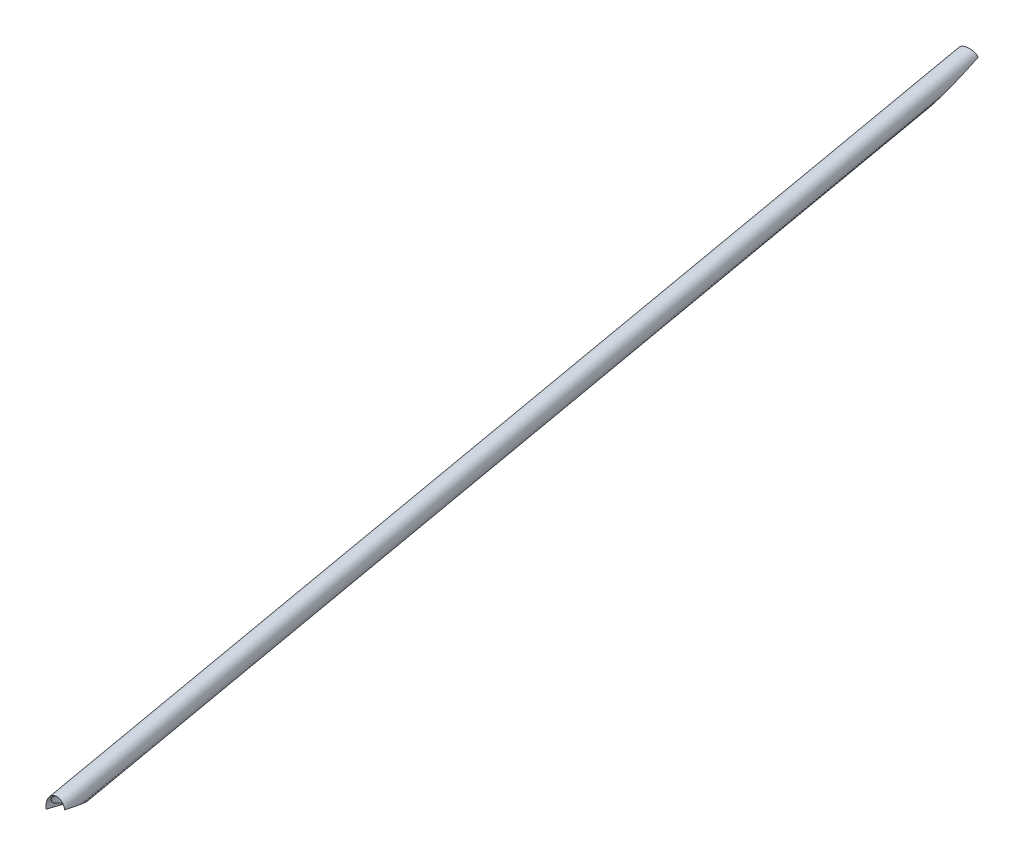
ISO-10303-21;
HEADER;
FILE_DESCRIPTION(('STEP AP214'),'2;1');
FILE_NAME('part.step','',(''),(''),'','','');
FILE_SCHEMA(('AUTOMOTIVE_DESIGN { 1 0 10303 214 1 1 1 1 }'));
ENDSEC;
DATA;
#1=APPLICATION_CONTEXT('core data for automotive mechanical design processes');
#2=APPLICATION_PROTOCOL_DEFINITION('international standard','automotive_design',2000,#1);
#3=PRODUCT_CONTEXT('',#1,'mechanical');
#4=PRODUCT('Part','Part','',(#3));
#5=PRODUCT_RELATED_PRODUCT_CATEGORY('part','',(#4));
#6=PRODUCT_DEFINITION_FORMATION('','',#4);
#7=PRODUCT_DEFINITION_CONTEXT('part definition',#1,'design');
#8=PRODUCT_DEFINITION('design','',#6,#7);
#9=PRODUCT_DEFINITION_SHAPE('','',#8);
#10=(LENGTH_UNIT() NAMED_UNIT(*) SI_UNIT(.MILLI.,.METRE.));
#11=(NAMED_UNIT(*) PLANE_ANGLE_UNIT() SI_UNIT($,.RADIAN.));
#12=(NAMED_UNIT(*) SI_UNIT($,.STERADIAN.) SOLID_ANGLE_UNIT());
#13=UNCERTAINTY_MEASURE_WITH_UNIT(LENGTH_MEASURE(1.E-05),#10,'distance_accuracy_value','');
#14=(GEOMETRIC_REPRESENTATION_CONTEXT(3) GLOBAL_UNCERTAINTY_ASSIGNED_CONTEXT((#13)) GLOBAL_UNIT_ASSIGNED_CONTEXT((#10,
#11,#12)) REPRESENTATION_CONTEXT('',''));
#15=CARTESIAN_POINT('',(0.,0.,0.));
#16=DIRECTION('',(0.,0.,1.));
#17=DIRECTION('',(1.,0.,0.));
#18=AXIS2_PLACEMENT_3D('',#15,#16,#17);
#19=CARTESIAN_POINT('',(-325.,320.,-1580.));
#20=DIRECTION('',(0.0427126536783039,-0.062929792122569,-0.997103540500769));
#21=DIRECTION('',(0.,0.998014330188054,-0.0629872744234135));
#22=AXIS2_PLACEMENT_3D('',#19,#20,#21);
#23=PLANE('',#22);
#24=CARTESIAN_POINT('',(-325.,320.,-1580.));
#25=DIRECTION('',(0.0427126536783039,-0.062929792122569,-0.997103540500769));
#26=DIRECTION('',(-0.611440895819702,0.787641342485715,-0.0759022168747456));
#27=AXIS2_PLACEMENT_3D('',#24,#25,#26);
#28=ELLIPSE('',#27,11.2549576190536,11.);
#29=CARTESIAN_POINT('',(-315.659557692795,325.814860529695,-1579.96687694731));
#30=VERTEX_POINT('',#29);
#31=CARTESIAN_POINT('',(-314.891903689022,324.374891386604,-1579.84311297152));
#32=VERTEX_POINT('',#31);
#33=EDGE_CURVE('E116',#30,#32,#28,.T.);
#34=ORIENTED_EDGE('',*,*,#33,.T.);
#35=CARTESIAN_POINT('',(-325.,320.,-1580.));
#36=DIRECTION('',(0.0427126536783039,-0.062929792122569,-0.997103540500769));
#37=DIRECTION('',(0.489400664257567,-0.868759037548238,0.07579396085779));
#38=AXIS2_PLACEMENT_3D('',#35,#36,#37);
#39=ELLIPSE('',#38,12.7182524712078,11.);
#40=EDGE_CURVE('E121',#32,#30,#39,.F.);
#41=ORIENTED_EDGE('',*,*,#40,.T.);
#42=EDGE_LOOP('',(#34,#41));
#43=FACE_BOUND('',#42,.T.);
#44=ADVANCED_FACE('F41',(#43),#23,.T.);
#45=CARTESIAN_POINT('',(-225.,200.,-450.));
#46=DIRECTION('',(-0.0876619818920292,0.105194378270435,-0.99058039537993));
#47=DIRECTION('',(0.,0.994408591727349,0.105600912395825));
#48=AXIS2_PLACEMENT_3D('',#45,#46,#47);
#49=CYLINDRICAL_SURFACE('',#48,9.39999999999998);
#50=CARTESIAN_POINT('',(-324.393535402177,328.61968324485,-1572.15430146808));
#51=CARTESIAN_POINT('',(-324.166744376046,328.618152850045,-1572.13983609363));
#52=CARTESIAN_POINT('',(-323.940255561203,328.608186920859,-1572.12234851625));
#53=CARTESIAN_POINT('',(-323.489240649024,328.571639886614,-1572.08011292913));
#54=CARTESIAN_POINT('',(-323.264714756988,328.545057064204,-1572.0553641691));
#55=CARTESIAN_POINT('',(-322.819229238548,328.475722569363,-1571.99725162309));
#56=CARTESIAN_POINT('',(-322.598270695505,328.432966078034,-1571.96388527047));
#57=CARTESIAN_POINT('',(-322.16168061802,328.332043520105,-1571.88707140375));
#58=CARTESIAN_POINT('',(-321.946048892917,328.273878005912,-1571.84362425103));
#59=CARTESIAN_POINT('',(-321.521015898234,328.142984336842,-1571.74496227385));
#60=CARTESIAN_POINT('',(-321.311642807215,328.070199204964,-1571.68970135164));
#61=CARTESIAN_POINT('',(-320.901801533403,327.911743430264,-1571.56613146979));
#62=CARTESIAN_POINT('',(-320.701333190628,327.826073019059,-1571.49782274467));
#63=CARTESIAN_POINT('',(-320.311124293689,327.643870848528,-1571.34714859539));
#64=CARTESIAN_POINT('',(-320.121374420538,327.547348749386,-1571.26479564018));
#65=CARTESIAN_POINT('',(-319.753791772083,327.345662483027,-1571.08541295637));
#66=CARTESIAN_POINT('',(-319.575958450105,327.240498712743,-1570.98838390171));
#67=CARTESIAN_POINT('',(-319.243248327993,327.030366503856,-1570.78584562536));
#68=CARTESIAN_POINT('',(-319.087636252788,326.925751865243,-1570.68117326675));
#69=CARTESIAN_POINT('',(-318.788121665251,326.713046030105,-1570.45940671664));
#70=CARTESIAN_POINT('',(-318.644218601434,326.60495499765,-1570.34231311077));
#71=CARTESIAN_POINT('',(-318.367980034763,326.387071272029,-1570.09660203092));
#72=CARTESIAN_POINT('',(-318.235646852239,326.277278242703,-1569.96798225579));
#73=CARTESIAN_POINT('',(-317.982081819845,326.057483034995,-1569.70042122225));
#74=CARTESIAN_POINT('',(-317.860851385594,325.947480831764,-1569.56147865175));
#75=CARTESIAN_POINT('',(-317.550290410968,325.654382721319,-1569.17757493963));
#76=CARTESIAN_POINT('',(-317.370289008123,325.472116533096,-1568.92440912344));
#77=CARTESIAN_POINT('',(-317.034843784465,325.113382847678,-1568.39841452761));
#78=CARTESIAN_POINT('',(-316.879419114084,324.936919956438,-1568.12557065331));
#79=CARTESIAN_POINT('',(-316.661138915736,324.677180116869,-1567.7047325348));
#80=CARTESIAN_POINT('',(-316.590717847967,324.591244087139,-1567.56220110694));
#81=CARTESIAN_POINT('',(-316.454455598542,324.421166899664,-1567.2739063346));
#82=CARTESIAN_POINT('',(-316.388614454549,324.337025756683,-1567.12814296354));
#83=CARTESIAN_POINT('',(-316.261071310276,324.170569676423,-1566.83389243609));
#84=CARTESIAN_POINT('',(-316.199367583027,324.08825398692,-1566.6854064495));
#85=CARTESIAN_POINT('',(-316.079650130724,323.925364032842,-1566.38602088556));
#86=CARTESIAN_POINT('',(-316.02163635837,323.844789745952,-1566.23512133919));
#87=CARTESIAN_POINT('',(-315.863164184722,323.620583534103,-1565.80788270126));
#88=CARTESIAN_POINT('',(-315.766475118774,323.478853164775,-1565.52914291904));
#89=CARTESIAN_POINT('',(-315.582048085814,323.200344672482,-1564.96625629786));
#90=CARTESIAN_POINT('',(-315.494311731047,323.063567444352,-1564.68210849589));
#91=CARTESIAN_POINT('',(-315.326270276812,322.7943489937,-1564.10938257906));
#92=CARTESIAN_POINT('',(-315.245969710218,322.661910447423,-1563.82080188525));
#93=CARTESIAN_POINT('',(-315.091678164876,322.400915662425,-1563.24020694536));
#94=CARTESIAN_POINT('',(-315.017687622553,322.272359692635,-1562.94819246337));
#95=CARTESIAN_POINT('',(-314.874901513614,322.018314645094,-1562.36062007707));
#96=CARTESIAN_POINT('',(-314.806120141292,321.892834535699,-1562.0650548663));
#97=CARTESIAN_POINT('',(-314.673226940423,321.644852617209,-1561.47162976307));
#98=CARTESIAN_POINT('',(-314.609115268626,321.522350908182,-1561.17376979396));
#99=CARTESIAN_POINT('',(-314.422907735964,321.158808793711,-1560.27758044834));
#100=CARTESIAN_POINT('',(-314.306886049678,320.921635424291,-1559.67641756892));
#101=CARTESIAN_POINT('',(-314.086865663091,320.453549453743,-1558.46487790617));
#102=CARTESIAN_POINT('',(-313.982950481608,320.222687891199,-1557.85446658399));
#103=CARTESIAN_POINT('',(-313.785741125887,319.766874399662,-1556.6296969625));
#104=CARTESIAN_POINT('',(-313.692447709707,319.541922893342,-1556.01533838478));
#105=CARTESIAN_POINT('',(-313.515149129874,319.096923642695,-1554.7850515876));
#106=CARTESIAN_POINT('',(-313.43112435358,318.876866362289,-1554.16912961792));
#107=CARTESIAN_POINT('',(-313.271114123087,318.439986791619,-1552.93509035217));
#108=CARTESIAN_POINT('',(-313.195128820357,318.223164562372,-1552.31697301497));
#109=CARTESIAN_POINT('',(-313.05135602024,317.794300166978,-1551.08615614269));
#110=CARTESIAN_POINT('',(-312.983484683427,317.582231693243,-1550.47347552456));
#111=CARTESIAN_POINT('',(-312.854539133887,317.15962370905,-1549.24686863632));
#112=CARTESIAN_POINT('',(-312.79346498153,316.949084212187,-1548.6329423552));
#113=CARTESIAN_POINT('',(-312.677886580182,316.528901378868,-1547.40408693971));
#114=CARTESIAN_POINT('',(-312.623383086652,316.319258148129,-1546.78915769824));
#115=CARTESIAN_POINT('',(-312.520883613679,315.900366179054,-1545.55862280556));
#116=CARTESIAN_POINT('',(-312.472887636762,315.691117440872,-1544.94301715408));
#117=CARTESIAN_POINT('',(-312.383301105383,315.271780783987,-1543.70909954486));
#118=CARTESIAN_POINT('',(-312.341734636279,315.061692596751,-1543.09078592806));
#119=CARTESIAN_POINT('',(-312.265408330163,314.641007597507,-1541.8539146579));
#120=CARTESIAN_POINT('',(-312.230648453719,314.430410788454,-1541.23535700598));
#121=CARTESIAN_POINT('',(-312.168263835989,314.008347576727,-1539.99836928561));
#122=CARTESIAN_POINT('',(-312.140637113946,313.796881432058,-1539.37993922949));
#123=CARTESIAN_POINT('',(-312.092971471874,313.372603464718,-1538.14324886777));
#124=CARTESIAN_POINT('',(-312.072932517766,313.159791648095,-1537.52498856141));
#125=CARTESIAN_POINT('',(-312.041092387375,312.732539512356,-1536.28932446583));
#126=CARTESIAN_POINT('',(-312.029285160939,312.518100506625,-1535.67192038111));
#127=CARTESIAN_POINT('',(-312.014740298155,312.086960488704,-1534.4377971246));
#128=CARTESIAN_POINT('',(-312.012002566574,311.870259500289,-1533.82107794569));
#129=CARTESIAN_POINT('',(-312.016747344316,311.433804882827,-1532.58800529442));
#130=CARTESIAN_POINT('',(-312.024240854926,311.21404821974,-1531.97165292978));
#131=CARTESIAN_POINT('',(-312.051029184215,310.771054004296,-1530.74048465671));
#132=CARTESIAN_POINT('',(-312.070323277975,310.54781666658,-1530.12566865624));
#133=CARTESIAN_POINT('',(-312.122730249157,310.098435247635,-1528.90212940324));
#134=CARTESIAN_POINT('',(-312.155754227818,309.872318777539,-1528.29339229842));
#135=CARTESIAN_POINT('',(-312.238679610151,309.414623864186,-1527.07888462226));
#136=CARTESIAN_POINT('',(-312.288585336621,309.183044036107,-1526.47311485109));
#137=CARTESIAN_POINT('',(-312.379632281316,308.830645495741,-1525.56867643605));
#138=CARTESIAN_POINT('',(-312.41264294667,308.712448071844,-1525.2681639318));
#139=CARTESIAN_POINT('',(-312.484933119264,308.474036900943,-1524.66870254345));
#140=CARTESIAN_POINT('',(-312.5242123264,308.353823250711,-1524.3697535852));
#141=CARTESIAN_POINT('',(-312.610119114348,308.111098633547,-1523.77400921851));
#142=CARTESIAN_POINT('',(-312.656743222866,307.988588776136,-1523.47721286142));
#143=CARTESIAN_POINT('',(-312.758832340579,307.740796963194,-1522.88632670503));
#144=CARTESIAN_POINT('',(-312.81429610742,307.615515399338,-1522.59223653152));
#145=CARTESIAN_POINT('',(-312.908961430494,307.418300286299,-1522.13830814567));
#146=CARTESIAN_POINT('',(-312.944363173999,307.347529435882,-1521.97717045053));
#147=CARTESIAN_POINT('',(-313.019014726308,307.204824468857,-1521.65627916803));
#148=CARTESIAN_POINT('',(-313.058264946136,307.132890228684,-1521.49652573049));
#149=CARTESIAN_POINT('',(-313.141321360369,306.987517452331,-1521.17831799478));
#150=CARTESIAN_POINT('',(-313.185140039055,306.91407525913,-1521.01986860451));
#151=CARTESIAN_POINT('',(-313.278010595296,306.765713865408,-1520.70521992678));
#152=CARTESIAN_POINT('',(-313.327061890598,306.690794829974,-1520.54902039116));
#153=CARTESIAN_POINT('',(-313.430518558267,306.540560366071,-1520.24219223097));
#154=CARTESIAN_POINT('',(-313.484817735029,306.465273748395,-1520.09151400871));
#155=CARTESIAN_POINT('',(-313.600725249246,306.312841471143,-1519.79396612039));
#156=CARTESIAN_POINT('',(-313.662331835242,306.235696260557,-1519.64709555193));
#157=CARTESIAN_POINT('',(-313.794353893961,306.079577191816,-1519.35918189676));
#158=CARTESIAN_POINT('',(-313.864734371181,306.000611561335,-1519.21811846622));
#159=CARTESIAN_POINT('',(-314.016829316314,305.84038091468,-1518.9436879854));
#160=CARTESIAN_POINT('',(-314.098528966717,305.759119013413,-1518.81031119089));
#161=CARTESIAN_POINT('',(-314.220176032035,305.646474218432,-1518.6361323513));
#162=CARTESIAN_POINT('',(-314.253777348353,305.616112274972,-1518.59022148835));
#163=CARTESIAN_POINT('',(-314.323168774072,305.555078690179,-1518.5002883879));
#164=CARTESIAN_POINT('',(-314.358959224177,305.524407001262,-1518.45626644619));
#165=CARTESIAN_POINT('',(-314.470097704598,305.43183040837,-1518.32737120986));
#166=CARTESIAN_POINT('',(-314.549089912039,305.369479542131,-1518.24584957142));
#167=CARTESIAN_POINT('',(-314.71957065703,305.243452187576,-1518.09491702457));
#168=CARTESIAN_POINT('',(-314.811203365253,305.179768878212,-1518.02567065384));
#169=CARTESIAN_POINT('',(-315.007228541653,305.053587821186,-1517.90700320099));
#170=CARTESIAN_POINT('',(-315.111574237215,304.991086649853,-1517.85751214959));
#171=CARTESIAN_POINT('',(-315.299201091999,304.888036820324,-1517.79589833421));
#172=CARTESIAN_POINT('',(-315.379684430134,304.84642604477,-1517.77707297138));
#173=CARTESIAN_POINT('',(-315.544405271485,304.766706195082,-1517.75450879601));
#174=CARTESIAN_POINT('',(-315.628640034207,304.728594625055,-1517.75075914736));
#175=CARTESIAN_POINT('',(-315.798219363624,304.65707372239,-1517.75847623174));
#176=CARTESIAN_POINT('',(-315.883562258951,304.623658043797,-1517.76992220664));
#177=CARTESIAN_POINT('',(-316.053168385007,304.561952325962,-1517.80646151788));
#178=CARTESIAN_POINT('',(-316.13743030898,304.533668030374,-1517.8315700228));
#179=CARTESIAN_POINT('',(-316.34343877575,304.469636960443,-1517.90796638034));
#180=CARTESIAN_POINT('',(-316.463575606164,304.436910168836,-1517.96604378669));
#181=CARTESIAN_POINT('',(-316.696144891315,304.380726316634,-1518.09947769316));
#182=CARTESIAN_POINT('',(-316.808554413332,304.357295939962,-1518.1748829658));
#183=CARTESIAN_POINT('',(-317.020569544694,304.318706449936,-1518.33349483573));
#184=CARTESIAN_POINT('',(-317.120530478308,304.303205107761,-1518.41615525187));
#185=CARTESIAN_POINT('',(-317.314446632757,304.277432406108,-1518.58906936141));
#186=CARTESIAN_POINT('',(-317.408395795676,304.267166251621,-1518.67933050825));
#187=CARTESIAN_POINT('',(-317.591259017733,304.250797715472,-1518.86555765314));
#188=CARTESIAN_POINT('',(-317.68016002945,304.244705709729,-1518.96153722739));
#189=CARTESIAN_POINT('',(-317.853378454516,304.235936778268,-1519.15758013732));
#190=CARTESIAN_POINT('',(-317.937697951326,304.233258287584,-1519.2576415799));
#191=CARTESIAN_POINT('',(-318.164406798187,304.229738193567,-1519.53737966358));
#192=CARTESIAN_POINT('',(-318.302781030206,304.231792680889,-1519.7203411333));
#193=CARTESIAN_POINT('',(-318.570233536821,304.242265070548,-1520.09281189926));
#194=CARTESIAN_POINT('',(-318.699305889542,304.250686988073,-1520.28232525502));
#195=CARTESIAN_POINT('',(-318.950148009313,304.272503401108,-1520.66636248476));
#196=CARTESIAN_POINT('',(-319.071902532709,304.28590788525,-1520.86089568813));
#197=CARTESIAN_POINT('',(-319.309169247923,304.316703049182,-1521.25342841433));
#198=CARTESIAN_POINT('',(-319.424680690347,304.334094206209,-1521.45142834954));
#199=CARTESIAN_POINT('',(-319.651030969811,304.372261478178,-1521.85112681984));
#200=CARTESIAN_POINT('',(-319.761842163014,304.393054846094,-1522.0528392956));
#201=CARTESIAN_POINT('',(-319.97892084283,304.437437786665,-1522.45839475852));
#202=CARTESIAN_POINT('',(-320.085188093693,304.461027504161,-1522.66223785553));
#203=CARTESIAN_POINT('',(-320.293628813013,304.510568806316,-1523.07134957637));
#204=CARTESIAN_POINT('',(-320.395807861155,304.536517001857,-1523.27661577507));
#205=CARTESIAN_POINT('',(-320.596698455296,304.590498253325,-1523.68855206872));
#206=CARTESIAN_POINT('',(-320.695410110954,304.61853124323,-1523.89522211903));
#207=CARTESIAN_POINT('',(-321.025327226949,304.716801555426,-1524.5988078598));
#208=CARTESIAN_POINT('',(-321.249307888237,304.791371526844,-1525.09851467677));
#209=CARTESIAN_POINT('',(-321.683665494899,304.948633159571,-1526.10256952731));
#210=CARTESIAN_POINT('',(-321.894040202364,305.031326151349,-1526.60691830889));
#211=CARTESIAN_POINT('',(-322.303821639759,305.203386638039,-1527.61921725196));
#212=CARTESIAN_POINT('',(-322.503222661824,305.292757550484,-1528.12716913537));
#213=CARTESIAN_POINT('',(-322.892785843436,305.477113710356,-1529.14559414507));
#214=CARTESIAN_POINT('',(-323.082947704512,305.572099138941,-1529.65606735222));
#215=CARTESIAN_POINT('',(-323.455821695256,305.767192141354,-1530.68014156886));
#216=CARTESIAN_POINT('',(-323.63851534929,305.867311182028,-1531.19374710244));
#217=CARTESIAN_POINT('',(-323.997031162412,306.071947384795,-1532.22248003313));
#218=CARTESIAN_POINT('',(-324.172853228877,306.176464606131,-1532.73760745067));
#219=CARTESIAN_POINT('',(-324.518394578933,306.389485588162,-1533.7688926354));
#220=CARTESIAN_POINT('',(-324.688115767724,306.497988082544,-1534.28505002686));
#221=CARTESIAN_POINT('',(-325.022172784069,306.718745752563,-1535.31830513144));
#222=CARTESIAN_POINT('',(-325.186508560507,306.831000963799,-1535.83540285344));
#223=CARTESIAN_POINT('',(-325.671946634992,307.17286624229,-1537.38672943359));
#224=CARTESIAN_POINT('',(-325.985832124972,307.407795607647,-1538.42205171619));
#225=CARTESIAN_POINT('',(-326.597715273008,307.891153945674,-1540.49430429743));
#226=CARTESIAN_POINT('',(-326.895711654766,308.139583999565,-1541.53123471839));
#227=CARTESIAN_POINT('',(-327.47787414483,308.649852234934,-1543.60421842804));
#228=CARTESIAN_POINT('',(-327.762056851185,308.911673508257,-1544.64027122202));
#229=CARTESIAN_POINT('',(-328.318875373602,309.450128602918,-1546.71158186332));
#230=CARTESIAN_POINT('',(-328.59151170533,309.7267617615,-1547.74683974411));
#231=CARTESIAN_POINT('',(-329.097896135504,310.266413602664,-1549.70364746579));
#232=CARTESIAN_POINT('',(-329.332666496747,310.527681457126,-1550.62541552261));
#233=CARTESIAN_POINT('',(-329.795175962748,311.066707312676,-1552.46620441503));
#234=CARTESIAN_POINT('',(-330.022913199639,311.344469638101,-1553.38522446325));
#235=CARTESIAN_POINT('',(-330.359551888685,311.776701669569,-1554.7595980859));
#236=CARTESIAN_POINT('',(-330.47088941895,311.923309729708,-1555.21683125696));
#237=CARTESIAN_POINT('',(-330.69197828875,312.222588870588,-1556.12969070944));
#238=CARTESIAN_POINT('',(-330.801729655572,312.375259846859,-1556.5853170184));
#239=CARTESIAN_POINT('',(-331.019622216439,312.68765801293,-1557.49443326885));
#240=CARTESIAN_POINT('',(-331.127763721097,312.847383817318,-1557.94792361062));
#241=CARTESIAN_POINT('',(-331.342377414699,313.175251513544,-1558.85223866014));
#242=CARTESIAN_POINT('',(-331.448849664475,313.343393097747,-1559.30306346467));
#243=CARTESIAN_POINT('',(-331.667321912307,313.701954320049,-1560.23266072843));
#244=CARTESIAN_POINT('',(-331.77918774473,313.893109609049,-1560.71118275422));
#245=CARTESIAN_POINT('',(-332.000320985761,314.289934534223,-1561.66289644435));
#246=CARTESIAN_POINT('',(-332.109587998602,314.495606362394,-1562.13608729112));
#247=CARTESIAN_POINT('',(-332.324640219936,314.925465072801,-1563.07528895264));
#248=CARTESIAN_POINT('',(-332.430423152483,315.149663734717,-1563.54129497225));
#249=CARTESIAN_POINT('',(-332.584993597084,315.503716502723,-1564.2320568729));
#250=CARTESIAN_POINT('',(-332.635828349826,315.624680615206,-1564.46091449862));
#251=CARTESIAN_POINT('',(-332.735744221037,315.873385758093,-1564.91529754758));
#252=CARTESIAN_POINT('',(-332.784825451152,316.001126355749,-1565.14082318241));
#253=CARTESIAN_POINT('',(-332.894230189314,316.301346938812,-1565.65070407064));
#254=CARTESIAN_POINT('',(-332.953833444061,316.476305823629,-1565.93376679668));
#255=CARTESIAN_POINT('',(-333.067840307244,316.841194956429,-1566.49129147616));
#256=CARTESIAN_POINT('',(-333.122243198808,317.031127261937,-1566.76575224032));
#257=CARTESIAN_POINT('',(-333.223483357293,317.427989982829,-1567.30275759664));
#258=CARTESIAN_POINT('',(-333.27033617921,317.634884089851,-1567.56532586606));
#259=CARTESIAN_POINT('',(-333.353394883943,318.068299740754,-1568.07555027414));
#260=CARTESIAN_POINT('',(-333.389605910744,318.294811733046,-1568.32321357129));
#261=CARTESIAN_POINT('',(-333.438296895622,318.697025537932,-1568.72710438036));
#262=CARTESIAN_POINT('',(-333.454643563275,318.867293124082,-1568.88827622422));
#263=CARTESIAN_POINT('',(-333.478237758321,319.218090080519,-1569.1997139158));
#264=CARTESIAN_POINT('',(-333.485488404091,319.398615911787,-1569.34998348447));
#265=CARTESIAN_POINT('',(-333.488939894651,319.769227764502,-1569.6379953166));
#266=CARTESIAN_POINT('',(-333.485152979778,319.959302966163,-1569.77575128252));
#267=CARTESIAN_POINT('',(-333.46459082411,320.347948143872,-1570.03769377167));
#268=CARTESIAN_POINT('',(-333.447815878408,320.546517926824,-1570.16188060312));
#269=CARTESIAN_POINT('',(-333.399335703178,320.951677775386,-1570.39680664297));
#270=CARTESIAN_POINT('',(-333.367522765877,321.158315671359,-1570.50744147032));
#271=CARTESIAN_POINT('',(-333.287524077419,321.575694797111,-1570.71411749205));
#272=CARTESIAN_POINT('',(-333.239337764623,321.786436167415,-1570.81015818566));
#273=CARTESIAN_POINT('',(-333.12567055891,322.209360764157,-1570.98830417748));
#274=CARTESIAN_POINT('',(-333.060174602559,322.421545088847,-1571.07039723528));
#275=CARTESIAN_POINT('',(-332.911571836265,322.844325650221,-1571.22167453957));
#276=CARTESIAN_POINT('',(-332.828465429497,323.054921923146,-1571.29085908154));
#277=CARTESIAN_POINT('',(-332.653249722741,323.452668570089,-1571.41193202894));
#278=CARTESIAN_POINT('',(-332.562673801786,323.640192408152,-1571.46482642012));
#279=CARTESIAN_POINT('',(-332.367494365673,324.009985928576,-1571.5623597877));
#280=CARTESIAN_POINT('',(-332.262892006025,324.192256042243,-1571.60699944341));
#281=CARTESIAN_POINT('',(-332.040196792772,324.550012572845,-1571.68918580965));
#282=CARTESIAN_POINT('',(-331.922104087684,324.725499064435,-1571.72673259826));
#283=CARTESIAN_POINT('',(-331.673088626338,325.068370788997,-1571.7958064218));
#284=CARTESIAN_POINT('',(-331.542164995246,325.23575546841,-1571.82733304583));
#285=CARTESIAN_POINT('',(-331.256781627225,325.574884312688,-1571.88773310628));
#286=CARTESIAN_POINT('',(-331.101269239093,325.745822325882,-1571.91616414308));
#287=CARTESIAN_POINT('',(-330.777104941512,326.075560316132,-1571.96806682559));
#288=CARTESIAN_POINT('',(-330.608452452036,326.234359756758,-1571.99153825221));
#289=CARTESIAN_POINT('',(-330.259034588555,326.538796494177,-1572.03432370862));
#290=CARTESIAN_POINT('',(-330.078263823662,326.6844278645,-1572.05363587184));
#291=CARTESIAN_POINT('',(-329.705827841629,326.961503598389,-1572.08867666493));
#292=CARTESIAN_POINT('',(-329.514162196479,327.092947404002,-1572.1044051539));
#293=CARTESIAN_POINT('',(-329.108059539038,327.349064029084,-1572.13360659685));
#294=CARTESIAN_POINT('',(-328.892955727151,327.472706168194,-1572.14686015799));
#295=CARTESIAN_POINT('',(-328.453198766995,327.702058981006,-1572.16996269268));
#296=CARTESIAN_POINT('',(-328.228544723195,327.807767968446,-1572.17981134616));
#297=CARTESIAN_POINT('',(-327.7713888279,328.000453804092,-1572.19608252684));
#298=CARTESIAN_POINT('',(-327.538892299414,328.087443073535,-1572.2025073301));
#299=CARTESIAN_POINT('',(-327.067585768163,328.242163674242,-1572.21167721915));
#300=CARTESIAN_POINT('',(-326.828776991683,328.30989871642,-1572.21442301438));
#301=CARTESIAN_POINT('',(-326.228642544834,328.453929110908,-1572.2160754864));
#302=CARTESIAN_POINT('',(-325.864372919274,328.518285043702,-1572.21245634714));
#303=CARTESIAN_POINT('',(-325.130981587413,328.602404583916,-1572.19331565974));
#304=CARTESIAN_POINT('',(-324.761859937965,328.62216871337,-1572.17779425094));
#305=CARTESIAN_POINT('',(-324.393535402177,328.61968324485,-1572.15430146808));
#306=B_SPLINE_CURVE_WITH_KNOTS('',3,(#50,#51,#52,#53,#54,#55,#56,#57,#58,#59,#60,#61,#62,#63,
#64,#65,#66,#67,#68,#69,#70,#71,#72,#73,#74,#75,#76,#77,#78,#79,#80,#81,#82,#83,#84,#85,#86,#87,
#88,#89,#90,#91,#92,#93,#94,#95,#96,#97,#98,#99,#100,#101,#102,#103,#104,#105,#106,#107,#108,
#109,#110,#111,#112,#113,#114,#115,#116,#117,#118,#119,#120,#121,#122,#123,#124,#125,#126,#127,
#128,#129,#130,#131,#132,#133,#134,#135,#136,#137,#138,#139,#140,#141,#142,#143,#144,#145,#146,
#147,#148,#149,#150,#151,#152,#153,#154,#155,#156,#157,#158,#159,#160,#161,#162,#163,#164,#165,
#166,#167,#168,#169,#170,#171,#172,#173,#174,#175,#176,#177,#178,#179,#180,#181,#182,#183,#184,
#185,#186,#187,#188,#189,#190,#191,#192,#193,#194,#195,#196,#197,#198,#199,#200,#201,#202,#203,
#204,#205,#206,#207,#208,#209,#210,#211,#212,#213,#214,#215,#216,#217,#218,#219,#220,#221,#222,
#223,#224,#225,#226,#227,#228,#229,#230,#231,#232,#233,#234,#235,#236,#237,#238,#239,#240,#241,
#242,#243,#244,#245,#246,#247,#248,#249,#250,#251,#252,#253,#254,#255,#256,#257,#258,#259,#260,
#261,#262,#263,#264,#265,#266,#267,#268,#269,#270,#271,#272,#273,#274,#275,#276,#277,#278,#279,
#280,#281,#282,#283,#284,#285,#286,#287,#288,#289,#290,#291,#292,#293,#294,#295,#296,#297,#298,
#299,#300,#301,#302,#303,#304,#305),.UNSPECIFIED.,.T.,.F.,(4,2,2,2,2,2,2,2,2,2,2,2,2,2,2,2,2,2,
2,2,2,2,2,2,2,2,2,2,2,2,2,2,2,2,2,2,2,2,2,2,2,2,2,2,2,2,2,2,2,2,2,2,2,2,2,2,2,2,2,2,2,2,2,2,2,2,
2,2,2,2,2,2,2,2,2,2,2,2,2,2,2,2,2,2,2,2,2,2,2,2,2,2,2,2,2,2,2,2,2,2,2,2,2,2,2,2,2,2,2,2,2,2,2,2,
2,2,2,2,2,2,2,2,2,2,2,2,2,4),(0.,0.681497577746431,1.36306559972584,2.04483685309741,
2.72658366854434,3.41104088958695,4.09548580880881,4.77932618814396,5.46313517457438,
6.10664147176979,6.75011744278721,7.39372216770818,8.03740883937636,9.11599519294892,
10.1954178935908,10.7374971382953,11.2795808402346,11.8214368481829,12.3632859089024,
13.3449419856626,14.3267745327553,15.3092017205597,16.2916968018014,17.2767793151,
18.2618948797284,20.2313778348187,22.2137304526701,24.1962244592677,26.1744395621827,
28.1526919293953,30.1083127820396,32.0639510020034,34.0198138574233,35.9756774723035,
37.9386991359296,39.9017094266077,41.8641740343158,43.8266298275979,45.7876417306838,
47.7486330422547,49.7117345987174,51.6747155724977,53.625179766227,55.5761437809576,
56.5499026721535,57.5236149591171,58.4968682984296,59.4699849738909,60.0085024444581,
60.5470774920977,61.087164931174,61.6271923352535,62.1579624067756,62.6886055180411,
63.2171960442117,63.7451010375852,63.9385076938406,64.1319445276546,64.5195577326756,
64.9120274918311,65.3030946002334,65.5794644279453,65.8556355712466,66.1314298364025,
66.407530923905,66.8173488615048,67.2283347527188,67.6196484524906,68.0113504540919,
68.4040226332806,68.7965147225401,69.4841644879416,70.1722482351108,70.8617189003693,
71.5512721437622,72.2444372065337,72.9376381886024,73.6298583358792,74.3220565713764,
75.9796693624901,77.6375541082108,79.2962931921871,80.955085826128,82.6177604352436,
84.2804574481843,85.9426306368921,87.6048195974033,90.9257829245877,94.2470126083102,
97.56414763078,100.881134352178,103.840279148049,106.800203194331,108.278875213934,
109.757521765761,111.235879223944,112.714182680751,114.295871784394,115.877800236127,
117.460742360571,118.252059778898,119.043326724237,120.057125022329,121.071062871896,
122.08288428873,123.094215808243,123.798718068108,124.502978738364,125.206458701022,
125.909922680856,126.618503296961,127.327108221238,128.036331839517,128.745539222497,
129.389449904782,130.033307573701,130.67715815498,131.321052665706,132.018797459746,
132.71657307084,133.414661178343,134.11277672954,134.857291986797,135.601877212415,
136.345966843832,137.089912967679,138.196725798354,139.303525671547),.UNSPECIFIED.);
#307=CARTESIAN_POINT('',(-324.393535402177,328.61968324485,-1572.15430146808));
#308=VERTEX_POINT('',#307);
#309=EDGE_CURVE('E109',#308,#308,#306,.T.);
#310=ORIENTED_EDGE('',*,*,#309,.T.);
#311=EDGE_LOOP('',(#310));
#312=FACE_BOUND('',#311,.T.);
#313=CARTESIAN_POINT('',(-225.503728422555,209.951914869303,-454.699482598345));
#314=CARTESIAN_POINT('',(-225.766754666981,209.950146645712,-454.682821076864));
#315=CARTESIAN_POINT('',(-226.029769224154,209.937378451151,-454.667547530417));
#316=CARTESIAN_POINT('',(-226.553996388733,209.889830942093,-454.638954982262));
#317=CARTESIAN_POINT('',(-226.815208474911,209.855045509948,-454.625636525058));
#318=CARTESIAN_POINT('',(-227.3341141149,209.763576078458,-454.600363914103));
#319=CARTESIAN_POINT('',(-227.591803747248,209.706869451541,-454.588411186662));
#320=CARTESIAN_POINT('',(-228.101505821079,209.571911109469,-454.565513546577));
#321=CARTESIAN_POINT('',(-228.353518670878,209.493660949272,-454.554568561273));
#322=CARTESIAN_POINT('',(-228.8500053646,209.316159022566,-454.533503167458));
#323=CARTESIAN_POINT('',(-229.094480965353,209.216912193156,-454.523382565878));
#324=CARTESIAN_POINT('',(-229.574204116633,208.998103092676,-454.503954941196));
#325=CARTESIAN_POINT('',(-229.809451504917,208.87854046463,-454.494647932394));
#326=CARTESIAN_POINT('',(-230.268966354166,208.620010653223,-454.477015021943));
#327=CARTESIAN_POINT('',(-230.493237393812,208.481049852051,-454.468688799261));
#328=CARTESIAN_POINT('',(-230.929312912038,208.184718621415,-454.453353815442));
#329=CARTESIAN_POINT('',(-231.141117458323,208.027348291947,-454.44634504715));
#330=CARTESIAN_POINT('',(-231.5504216029,207.695681568225,-454.434183337322));
#331=CARTESIAN_POINT('',(-231.74794751308,207.521417768057,-454.429026908957));
#332=CARTESIAN_POINT('',(-232.127819996527,207.157009881126,-454.421281669115));
#333=CARTESIAN_POINT('',(-232.310166452654,206.966865671837,-454.418692877449));
#334=CARTESIAN_POINT('',(-232.658606151534,206.571994460622,-454.417050816264));
#335=CARTESIAN_POINT('',(-232.82468891784,206.367258203851,-454.417999810475));
#336=CARTESIAN_POINT('',(-233.139416405739,205.944868537969,-454.424693003544));
#337=CARTESIAN_POINT('',(-233.288061359178,205.727215300653,-454.43043713864));
#338=CARTESIAN_POINT('',(-233.567708998986,205.279562432993,-454.448365698789));
#339=CARTESIAN_POINT('',(-233.69861862608,205.049505911317,-454.460582559157));
#340=CARTESIAN_POINT('',(-233.941134003871,204.57996166189,-454.493532488303));
#341=CARTESIAN_POINT('',(-234.052737387149,204.340472781914,-454.514266600453));
#342=CARTESIAN_POINT('',(-234.255895912225,203.854564110472,-454.566790201194));
#343=CARTESIAN_POINT('',(-234.347470397701,203.60815126803,-454.598568945504));
#344=CARTESIAN_POINT('',(-234.510259958206,203.110898630535,-454.676302686916));
#345=CARTESIAN_POINT('',(-234.581483243739,202.860060664245,-454.722251951452));
#346=CARTESIAN_POINT('',(-234.686069329866,202.429124208838,-454.816264173284));
#347=CARTESIAN_POINT('',(-234.724435810366,202.249277031463,-454.85997772237));
#348=CARTESIAN_POINT('',(-234.790857825282,201.890544586761,-454.957867573267));
#349=CARTESIAN_POINT('',(-234.818916229432,201.7116590654,-455.01204095668));
#350=CARTESIAN_POINT('',(-234.864971960572,201.356889255828,-455.132048596652));
#351=CARTESIAN_POINT('',(-234.882988596096,201.180999842691,-455.197860151697));
#352=CARTESIAN_POINT('',(-234.909559171383,200.833785054884,-455.342259163417));
#353=CARTESIAN_POINT('',(-234.918113199735,200.662459637502,-455.420846500478));
#354=CARTESIAN_POINT('',(-234.926557878165,200.325379744433,-455.591860478709));
#355=CARTESIAN_POINT('',(-234.926398450291,200.159662949507,-455.684364069105));
#356=CARTESIAN_POINT('',(-234.918333436646,199.836683686375,-455.882796874676));
#357=CARTESIAN_POINT('',(-234.910428201525,199.679420835805,-455.988725481917));
#358=CARTESIAN_POINT('',(-234.888080045215,199.37466883281,-456.213300443503));
#359=CARTESIAN_POINT('',(-234.873634404084,199.227183775935,-456.331952073255));
#360=CARTESIAN_POINT('',(-234.839454829878,198.942815920816,-456.580632059768));
#361=CARTESIAN_POINT('',(-234.819720066907,198.805934790744,-456.710662199731));
#362=CARTESIAN_POINT('',(-234.769292995952,198.501695599911,-457.022798876615));
#363=CARTESIAN_POINT('',(-234.73710489182,198.338228855967,-457.208455513543));
#364=CARTESIAN_POINT('',(-234.667756831178,198.028815091433,-457.592936972427));
#365=CARTESIAN_POINT('',(-234.630594571651,197.882876245949,-457.791767872362));
#366=CARTESIAN_POINT('',(-234.552669914379,197.606183734848,-458.200030631417));
#367=CARTESIAN_POINT('',(-234.511895102676,197.475486311113,-458.409497898498));
#368=CARTESIAN_POINT('',(-234.427839256108,197.227784975971,-458.835759299047));
#369=CARTESIAN_POINT('',(-234.384558671898,197.110778613647,-459.052552112143));
#370=CARTESIAN_POINT('',(-234.274610157239,196.834443765353,-459.598041926513));
#371=CARTESIAN_POINT('',(-234.206777611045,196.682102575762,-459.930030217572));
#372=CARTESIAN_POINT('',(-234.067718440336,196.397409175755,-460.601855313532));
#373=CARTESIAN_POINT('',(-233.996489771964,196.265069207436,-460.941696779591));
#374=CARTESIAN_POINT('',(-233.850709917407,196.016053481783,-461.627175208879));
#375=CARTESIAN_POINT('',(-233.776151939468,195.899411893687,-461.972823029302));
#376=CARTESIAN_POINT('',(-233.623772575122,195.679106436525,-462.667390852141));
#377=CARTESIAN_POINT('',(-233.545951919251,195.575439682798,-463.016310108619));
#378=CARTESIAN_POINT('',(-233.386221551255,195.378169833071,-463.718765285171));
#379=CARTESIAN_POINT('',(-233.304287264765,195.284641359546,-464.072316443741));
#380=CARTESIAN_POINT('',(-233.136482592371,195.106853739464,-464.780818359061));
#381=CARTESIAN_POINT('',(-233.05061203056,195.022595007735,-465.13576917771));
#382=CARTESIAN_POINT('',(-232.8746595431,194.862299299785,-465.845943397924));
#383=CARTESIAN_POINT('',(-232.784583464781,194.786251367877,-466.201165783083));
#384=CARTESIAN_POINT('',(-232.599672534893,194.641431118156,-466.911856207857));
#385=CARTESIAN_POINT('',(-232.504837623218,194.572658892273,-467.267324250519));
#386=CARTESIAN_POINT('',(-232.29697368981,194.433139771692,-468.02528550201));
#387=CARTESIAN_POINT('',(-232.183201570693,194.363344863421,-468.427750699562));
#388=CARTESIAN_POINT('',(-231.948131105274,194.231888080096,-469.231823503245));
#389=CARTESIAN_POINT('',(-231.826832574936,194.170226404031,-469.633431088158));
#390=CARTESIAN_POINT('',(-231.575646573034,194.054778402126,-470.435603130184));
#391=CARTESIAN_POINT('',(-231.445749580381,194.001001025708,-470.836165902673));
#392=CARTESIAN_POINT('',(-231.176393410744,193.90147620462,-471.635063293919));
#393=CARTESIAN_POINT('',(-231.036934600361,193.855728452335,-472.033397997468));
#394=CARTESIAN_POINT('',(-230.748283821372,193.772941193731,-472.823760442083));
#395=CARTESIAN_POINT('',(-230.59917995637,193.735834075656,-473.215813133367));
#396=CARTESIAN_POINT('',(-230.288579409638,193.670488823426,-473.99582951698));
#397=CARTESIAN_POINT('',(-230.127080850938,193.642252035846,-474.383792579845));
#398=CARTESIAN_POINT('',(-229.7898936984,193.595717918055,-475.153382767146));
#399=CARTESIAN_POINT('',(-229.614228821,193.577404356114,-475.535019242637));
#400=CARTESIAN_POINT('',(-229.245805905284,193.552183109619,-476.290266322204));
#401=CARTESIAN_POINT('',(-229.053055326287,193.545270473212,-476.663880341105));
#402=CARTESIAN_POINT('',(-228.739650892167,193.545206969257,-477.231346154766));
#403=CARTESIAN_POINT('',(-228.62634149764,193.547208034209,-477.429263028711));
#404=CARTESIAN_POINT('',(-228.39278925757,193.555784658959,-477.820916491767));
#405=CARTESIAN_POINT('',(-228.272545721067,193.562360675358,-478.014652661634));
#406=CARTESIAN_POINT('',(-228.024069402869,193.580746617965,-478.397094586202));
#407=CARTESIAN_POINT('',(-227.895825545922,193.592563944643,-478.585792826775));
#408=CARTESIAN_POINT('',(-227.63044453247,193.622262440901,-478.956344350721));
#409=CARTESIAN_POINT('',(-227.493309112975,193.640142428981,-479.138198960128));
#410=CARTESIAN_POINT('',(-227.238248185392,193.678600621966,-479.456330581665));
#411=CARTESIAN_POINT('',(-227.122200362578,193.697860072696,-479.594267226382));
#412=CARTESIAN_POINT('',(-226.883048555356,193.741519121546,-479.863006385351));
#413=CARTESIAN_POINT('',(-226.759946709775,193.765917167551,-479.99381103884));
#414=CARTESIAN_POINT('',(-226.506230067192,193.820574171263,-480.246121103165));
#415=CARTESIAN_POINT('',(-226.375631988119,193.850820418164,-480.36764589843));
#416=CARTESIAN_POINT('',(-226.106191342382,193.918064831214,-480.599038557475));
#417=CARTESIAN_POINT('',(-225.967354650387,193.955058224328,-480.708914575439));
#418=CARTESIAN_POINT('',(-225.654674392315,194.04426427406,-480.93265841396));
#419=CARTESIAN_POINT('',(-225.479091080252,194.098024932817,-481.043538354454));
#420=CARTESIAN_POINT('',(-225.116673164347,194.21765233985,-481.237260050356));
#421=CARTESIAN_POINT('',(-224.929850820583,194.283506051858,-481.320131727901));
#422=CARTESIAN_POINT('',(-224.642872684916,194.391847085714,-481.418120993191));
#423=CARTESIAN_POINT('',(-224.545445417109,194.429827843843,-481.446492565196));
#424=CARTESIAN_POINT('',(-224.349436951686,194.508744525876,-481.493330989019));
#425=CARTESIAN_POINT('',(-224.250856380301,194.549678903198,-481.511802982389));
#426=CARTESIAN_POINT('',(-224.053475566525,194.634206254653,-481.538282375391));
#427=CARTESIAN_POINT('',(-223.954675449484,194.677797967358,-481.546294700324));
#428=CARTESIAN_POINT('',(-223.757838676397,194.767223051662,-481.551703333226));
#429=CARTESIAN_POINT('',(-223.659801953125,194.813056223224,-481.549100586817));
#430=CARTESIAN_POINT('',(-223.395194558045,194.940261527695,-481.527760981584));
#431=CARTESIAN_POINT('',(-223.230218255702,195.023412899301,-481.498736997097));
#432=CARTESIAN_POINT('',(-222.909246499287,195.19236675374,-481.4129754113));
#433=CARTESIAN_POINT('',(-222.753258052097,195.27817122694,-481.356216506246));
#434=CARTESIAN_POINT('',(-222.378591253701,195.492474247158,-481.186533512315));
#435=CARTESIAN_POINT('',(-222.16647605845,195.621369961161,-481.059717537245));
#436=CARTESIAN_POINT('',(-221.766483371042,195.876855493377,-480.77059892893));
#437=CARTESIAN_POINT('',(-221.578674817464,196.003437914739,-480.608198734455));
#438=CARTESIAN_POINT('',(-221.240332716923,196.241833251853,-480.274493846212));
#439=CARTESIAN_POINT('',(-221.087973820204,196.353966445223,-480.105226299257));
#440=CARTESIAN_POINT('',(-220.798681982467,196.575019578009,-479.751908751739));
#441=CARTESIAN_POINT('',(-220.661763006673,196.683936543705,-479.567845622387));
#442=CARTESIAN_POINT('',(-220.400949490473,196.898857908026,-479.188444550523));
#443=CARTESIAN_POINT('',(-220.277085582729,197.004855043536,-478.993081686176));
#444=CARTESIAN_POINT('',(-220.040919093449,197.213904852641,-478.594156405638));
#445=CARTESIAN_POINT('',(-219.928612355131,197.316958575196,-478.390596974426));
#446=CARTESIAN_POINT('',(-219.66264891451,197.569121757662,-477.878192998897));
#447=CARTESIAN_POINT('',(-219.514891603823,197.716696251083,-477.565538172066));
#448=CARTESIAN_POINT('',(-219.23735571019,198.007113750584,-476.930135303417));
#449=CARTESIAN_POINT('',(-219.107585869031,198.149954430582,-476.607382446769));
#450=CARTESIAN_POINT('',(-218.863158797981,198.431895279104,-475.953862778433));
#451=CARTESIAN_POINT('',(-218.748529645557,198.570988127743,-475.62308238786));
#452=CARTESIAN_POINT('',(-218.5326579006,198.845827721694,-474.955921151812));
#453=CARTESIAN_POINT('',(-218.431413022858,198.981575034988,-474.619541273455));
#454=CARTESIAN_POINT('',(-218.240308076203,199.251017250445,-473.940740631579));
#455=CARTESIAN_POINT('',(-218.150505911708,199.384698921712,-473.598298413621));
#456=CARTESIAN_POINT('',(-217.981711470294,199.649899631145,-472.909929056817));
#457=CARTESIAN_POINT('',(-217.902719601924,199.781418587411,-472.564001786793));
#458=CARTESIAN_POINT('',(-217.754771692706,200.04268685518,-471.869789482527));
#459=CARTESIAN_POINT('',(-217.685805088726,200.172437896833,-471.521507340556));
#460=CARTESIAN_POINT('',(-217.55719308387,200.430839372855,-470.822832559333));
#461=CARTESIAN_POINT('',(-217.497547541935,200.559489823852,-470.472439952103));
#462=CARTESIAN_POINT('',(-217.387119158368,200.816344640008,-469.769764913256));
#463=CARTESIAN_POINT('',(-217.336343713586,200.944548546309,-469.417481154511));
#464=CARTESIAN_POINT('',(-217.243493169339,201.200993864524,-468.711780257088));
#465=CARTESIAN_POINT('',(-217.20141815171,201.329235276779,-468.35836310778));
#466=CARTESIAN_POINT('',(-217.125912551331,201.586503186796,-467.650617282967));
#467=CARTESIAN_POINT('',(-217.092487842391,201.715530157442,-467.296288152227));
#468=CARTESIAN_POINT('',(-217.03450105852,201.975051482502,-466.587446451116));
#469=CARTESIAN_POINT('',(-217.009938807806,202.10554580776,-466.232933884524));
#470=CARTESIAN_POINT('',(-216.970208001575,202.368281288339,-465.526013142039));
#471=CARTESIAN_POINT('',(-216.954993814176,202.500510687325,-465.173603195449));
#472=CARTESIAN_POINT('',(-216.934515845253,202.768474514144,-464.469778119503));
#473=CARTESIAN_POINT('',(-216.929252928111,202.904209245417,-464.118363079214));
#474=CARTESIAN_POINT('',(-216.929864004553,203.180451079823,-463.417779880617));
#475=CARTESIAN_POINT('',(-216.935727696187,203.320953650203,-463.068609943933));
#476=CARTESIAN_POINT('',(-216.960353504832,203.608598340138,-462.373510697359));
#477=CARTESIAN_POINT('',(-216.979112491272,203.755738840114,-462.02758062159));
#478=CARTESIAN_POINT('',(-217.023769482877,204.010594458174,-461.450324405072));
#479=CARTESIAN_POINT('',(-217.045484402964,204.115922211216,-461.2176240643));
#480=CARTESIAN_POINT('',(-217.097361837912,204.331580840446,-460.755454177594));
#481=CARTESIAN_POINT('',(-217.127524952162,204.441912071159,-460.52598486211));
#482=CARTESIAN_POINT('',(-217.197856179462,204.668583508069,-460.071336493182));
#483=CARTESIAN_POINT('',(-217.238031710224,204.784928118407,-459.846160754383));
#484=CARTESIAN_POINT('',(-217.330338507706,205.024502858712,-459.401967703588));
#485=CARTESIAN_POINT('',(-217.382468115495,205.147732031478,-459.182949541803));
#486=CARTESIAN_POINT('',(-217.491416943716,205.381133370404,-458.78844399118));
#487=CARTESIAN_POINT('',(-217.546081464142,205.490153169705,-458.611686951286));
#488=CARTESIAN_POINT('',(-217.667102304003,205.713822277533,-458.265835111024));
#489=CARTESIAN_POINT('',(-217.733458487236,205.828471520469,-458.096740221424));
#490=CARTESIAN_POINT('',(-217.879333506119,206.062897522979,-457.768752133604));
#491=CARTESIAN_POINT('',(-217.958816263972,206.18265957913,-457.609832585806));
#492=CARTESIAN_POINT('',(-218.132541560454,206.426760504936,-457.304008210218));
#493=CARTESIAN_POINT('',(-218.226779789241,206.551098030081,-457.157099893146));
#494=CARTESIAN_POINT('',(-218.413763361531,206.781512320789,-456.900993160957));
#495=CARTESIAN_POINT('',(-218.504082758413,206.887134347258,-456.789612411468));
#496=CARTESIAN_POINT('',(-218.695750811279,207.099094329586,-456.577529256727));
#497=CARTESIAN_POINT('',(-218.797098453718,207.205432218814,-456.476825871854));
#498=CARTESIAN_POINT('',(-219.010624921554,207.417302990052,-456.28653932706));
#499=CARTESIAN_POINT('',(-219.122808415665,207.522835503741,-456.196960998794));
#500=CARTESIAN_POINT('',(-219.357364439488,207.731405072102,-456.028933777816));
#501=CARTESIAN_POINT('',(-219.47973756972,207.834441979236,-455.950485541785));
#502=CARTESIAN_POINT('',(-219.733156307927,208.035938700342,-455.804583597309));
#503=CARTESIAN_POINT('',(-219.864154660204,208.13441912171,-455.737076018453));
#504=CARTESIAN_POINT('',(-220.1344069446,208.326020847074,-455.611722150192));
#505=CARTESIAN_POINT('',(-220.27366095086,208.419142102927,-455.553875947571));
#506=CARTESIAN_POINT('',(-220.559570957198,208.599010611939,-455.446749269854));
#507=CARTESIAN_POINT('',(-220.706233749862,208.685751829992,-455.397476846343));
#508=CARTESIAN_POINT('',(-221.005913041468,208.851905846201,-455.306447515903));
#509=CARTESIAN_POINT('',(-221.15893047833,208.931317556938,-455.264691723285));
#510=CARTESIAN_POINT('',(-221.492837964714,209.092975590344,-455.182075837496));
#511=CARTESIAN_POINT('',(-221.674571702305,209.173987132622,-455.142208175887));
#512=CARTESIAN_POINT('',(-222.043995981507,209.324765735767,-455.069415074479));
#513=CARTESIAN_POINT('',(-222.23168716683,209.394531576532,-455.036490387839));
#514=CARTESIAN_POINT('',(-222.611829915285,209.522218159728,-454.97630663297));
#515=CARTESIAN_POINT('',(-222.804278976371,209.580144985478,-454.949044654918));
#516=CARTESIAN_POINT('',(-223.192973570501,209.683772337916,-454.899073969145));
#517=CARTESIAN_POINT('',(-223.38921870454,209.729474142172,-454.876364785701));
#518=CARTESIAN_POINT('',(-223.901466421412,209.831655578519,-454.822202103349));
#519=CARTESIAN_POINT('',(-224.219723959451,209.878550999904,-454.793508890216));
#520=CARTESIAN_POINT('',(-224.859902320903,209.939767129609,-454.742343873922));
#521=CARTESIAN_POINT('',(-225.181824124343,209.954078907249,-454.719873777905));
#522=CARTESIAN_POINT('',(-225.503728422555,209.951914869303,-454.699482598345));
#523=B_SPLINE_CURVE_WITH_KNOTS('',3,(#313,#314,#315,#316,#317,#318,#319,#320,#321,#322,#323,
#324,#325,#326,#327,#328,#329,#330,#331,#332,#333,#334,#335,#336,#337,#338,#339,#340,#341,#342,
#343,#344,#345,#346,#347,#348,#349,#350,#351,#352,#353,#354,#355,#356,#357,#358,#359,#360,#361,
#362,#363,#364,#365,#366,#367,#368,#369,#370,#371,#372,#373,#374,#375,#376,#377,#378,#379,#380,
#381,#382,#383,#384,#385,#386,#387,#388,#389,#390,#391,#392,#393,#394,#395,#396,#397,#398,#399,
#400,#401,#402,#403,#404,#405,#406,#407,#408,#409,#410,#411,#412,#413,#414,#415,#416,#417,#418,
#419,#420,#421,#422,#423,#424,#425,#426,#427,#428,#429,#430,#431,#432,#433,#434,#435,#436,#437,
#438,#439,#440,#441,#442,#443,#444,#445,#446,#447,#448,#449,#450,#451,#452,#453,#454,#455,#456,
#457,#458,#459,#460,#461,#462,#463,#464,#465,#466,#467,#468,#469,#470,#471,#472,#473,#474,#475,
#476,#477,#478,#479,#480,#481,#482,#483,#484,#485,#486,#487,#488,#489,#490,#491,#492,#493,#494,
#495,#496,#497,#498,#499,#500,#501,#502,#503,#504,#505,#506,#507,#508,#509,#510,#511,#512,#513,
#514,#515,#516,#517,#518,#519,#520,#521,#522),.UNSPECIFIED.,.T.,.F.,(4,2,2,2,2,2,2,2,2,2,2,2,2,
2,2,2,2,2,2,2,2,2,2,2,2,2,2,2,2,2,2,2,2,2,2,2,2,2,2,2,2,2,2,2,2,2,2,2,2,2,2,2,2,2,2,2,2,2,2,2,2,
2,2,2,2,2,2,2,2,2,2,2,2,2,2,2,2,2,2,2,2,2,2,2,2,2,2,2,2,2,2,2,2,2,2,2,2,2,2,2,2,2,2,2,4),(0.,
0.790401470784092,1.58102265680314,2.37246212919184,3.16384449241929,3.95504097860937,
4.74625136863572,5.53720205352117,6.32814844233997,7.11759806097901,7.90705377125514,
8.69701471887739,9.4869651623669,10.2809120767419,11.0749562795243,11.8682301836865,
12.6611835954907,13.2277316667253,13.7941218931875,14.3594192614303,14.9247113373432,
15.4932525981573,16.0617681225905,16.630520291555,17.1993617536354,17.9464614967178,
18.6939083489564,19.4440314536094,20.1940200682126,21.3076551924111,22.4219691997656,
23.5386707062297,24.6551234966747,25.7793038625434,26.9035345157932,28.0262460684991,
29.1489718050756,30.4208896578471,31.69283862381,32.966220375426,34.2395533329244,
35.5025600704174,36.7657584480962,38.0268842867123,39.2874622263183,39.9715094374666,
40.6556249293912,41.3407094487184,42.0256605342923,42.5692283673463,43.1126322503158,
43.6548680822496,44.1967218055802,44.8383124296569,45.4792154387871,45.8038371840083,
46.1282901664309,46.4525903136852,46.7768615719694,47.3351274227248,47.8938227642416,
48.7252120589556,49.5589099484659,50.3193331205338,51.0804386610906,51.8432920774786,
52.6058701511936,53.7330111526611,54.8606980306148,55.9904476206383,57.1200040692176,
58.2550668613236,59.3901725383262,60.5240734032614,61.6579571067771,62.7927818981508,
63.9276173632567,65.0632214047989,66.198802921072,67.3287962019277,68.4588876312361,
69.5879332374646,70.7167048438086,71.4855870919423,72.2545239052293,73.0240320887387,
73.7934335481384,74.4372359830094,75.0810309184319,75.7230849935518,76.3649518833046,
76.8986247111839,77.4322485335504,77.9661033063555,78.4999895638199,79.0311614446598,
79.56233809651,80.0940109122272,80.625762481506,81.233987562769,81.8422785890987,
82.4502562631518,83.0581703760574,84.0252370748075,84.9925687998727),.UNSPECIFIED.);
#524=CARTESIAN_POINT('',(-225.503728422555,209.951914869303,-454.699482598345));
#525=VERTEX_POINT('',#524);
#526=EDGE_CURVE('E117',#525,#525,#523,.T.);
#527=ORIENTED_EDGE('',*,*,#526,.T.);
#528=EDGE_LOOP('',(#527));
#529=FACE_BOUND('',#528,.T.);
#530=ADVANCED_FACE('F94',(#312,#529),#49,.F.);
#531=CARTESIAN_POINT('',(-325.,320.,-1580.));
#532=DIRECTION('',(0.208710809439999,-0.381642622975999,0.900438063583998));
#533=DIRECTION('',(0.,-0.920714591276893,-0.390236647958419));
#534=AXIS2_PLACEMENT_3D('',#531,#532,#533);
#535=CYLINDRICAL_SURFACE('',#534,11.);
#536=ORIENTED_EDGE('',*,*,#309,.F.);
#537=EDGE_LOOP('',(#536));
#538=FACE_BOUND('',#537,.T.);
#539=CARTESIAN_POINT('',(-325.000000000001,320.000000000001,-1580.));
#540=DIRECTION('',(0.384326361991008,-0.877714805824,-0.286199173856417));
#541=DIRECTION('',(-0.150058846911564,0.246494284149993,-0.957456479608841));
#542=AXIS2_PLACEMENT_3D('',#539,#540,#541);
#543=ELLIPSE('',#542,69.849333819045,11.);
#544=CARTESIAN_POINT('',(-334.755235139212,315.051279321347,-1577.9232246896));
#545=VERTEX_POINT('',#544);
#546=EDGE_CURVE('E77',#32,#545,#543,.T.);
#547=ORIENTED_EDGE('',*,*,#546,.T.);
#548=CARTESIAN_POINT('',(-325.,320.,-1580.));
#549=DIRECTION('',(-0.00416950723616265,0.393939167319852,0.919127057408686));
#550=DIRECTION('',(-0.2871987901008,0.87994037819309,-0.37844654284329));
#551=AXIS2_PLACEMENT_3D('',#548,#549,#550);
#552=ELLIPSE('',#551,16.2624994633842,11.);
#553=CARTESIAN_POINT('',(-335.666738653991,317.492670443992,-1578.97374332974));
#554=VERTEX_POINT('',#553);
#555=EDGE_CURVE('E124',#554,#545,#552,.T.);
#556=ORIENTED_EDGE('',*,*,#555,.F.);
#557=CARTESIAN_POINT('',(-325.000000000001,320.000000000001,-1580.));
#558=DIRECTION('',(-0.150058846911564,0.246494284149993,-0.957456479608841));
#559=DIRECTION('',(0.384326361991008,-0.877714805824,-0.286199173856417));
#560=AXIS2_PLACEMENT_3D('',#557,#558,#559);
#561=ELLIPSE('',#560,11.1389936208953,11.);
#562=EDGE_CURVE('E120',#554,#30,#561,.T.);
#563=ORIENTED_EDGE('',*,*,#562,.T.);
#564=ORIENTED_EDGE('',*,*,#40,.F.);
#565=EDGE_LOOP('',(#547,#556,#563,#564));
#566=FACE_BOUND('',#565,.T.);
#567=ADVANCED_FACE('F91',(#538,#566),#535,.F.);
#568=CARTESIAN_POINT('',(-250.,0.,-1700.));
#569=DIRECTION('',(-0.214351342090107,0.914565726251124,0.342962147344171));
#570=DIRECTION('',(0.,-0.351123441588391,0.936329177569045));
#571=AXIS2_PLACEMENT_3D('',#568,#569,#570);
#572=CYLINDRICAL_SURFACE('',#571,11.);
#573=CARTESIAN_POINT('',(-325.,320.,-1580.));
#574=DIRECTION('',(-0.242541310856887,0.818950466320631,-0.520090228942098));
#575=DIRECTION('',(0.0809476542255871,-0.517144548792442,-0.852061613341216));
#576=AXIS2_PLACEMENT_3D('',#573,#574,#575);
#577=ELLIPSE('',#576,17.667792826144,11.);
#578=CARTESIAN_POINT('',(-335.634338905931,317.26363752886,-1579.3494952265));
#579=VERTEX_POINT('',#578);
#580=EDGE_CURVE('E123',#579,#554,#577,.T.);
#581=ORIENTED_EDGE('',*,*,#580,.T.);
#582=ORIENTED_EDGE('',*,*,#555,.T.);
#583=CARTESIAN_POINT('',(-325.,320.,-1580.));
#584=DIRECTION('',(0.0809476542255871,-0.517144548792442,-0.852061613341216));
#585=DIRECTION('',(-0.242541310856887,0.818950466320631,-0.520090228942098));
#586=AXIS2_PLACEMENT_3D('',#583,#584,#585);
#587=ELLIPSE('',#586,14.0568110074798,11.);
#588=EDGE_CURVE('E62',#545,#579,#587,.T.);
#589=ORIENTED_EDGE('',*,*,#588,.T.);
#590=EDGE_LOOP('',(#581,#582,#589));
#591=FACE_BOUND('',#590,.T.);
#592=ADVANCED_FACE('F43',(#591),#572,.F.);
#593=CARTESIAN_POINT('',(-225.,200.,-450.));
#594=DIRECTION('',(-0.0876619818920292,0.105194378270435,-0.99058039537993));
#595=DIRECTION('',(0.,0.994408591727349,0.105600912395825));
#596=AXIS2_PLACEMENT_3D('',#593,#594,#595);
#597=CYLINDRICAL_SURFACE('',#596,11.);
#598=ORIENTED_EDGE('',*,*,#588,.F.);
#599=ORIENTED_EDGE('',*,*,#546,.F.);
#600=ORIENTED_EDGE('',*,*,#33,.F.);
#601=ORIENTED_EDGE('',*,*,#562,.F.);
#602=ORIENTED_EDGE('',*,*,#580,.F.);
#603=EDGE_LOOP('',(#598,#599,#600,#601,#602));
#604=FACE_BOUND('',#603,.T.);
#605=CARTESIAN_POINT('',(-225.,200.,-449.999999999999));
#606=DIRECTION('',(-0.410073590459098,0.89186931574694,-0.190810833122935));
#607=DIRECTION('',(0.0454319322245433,-0.188975755350688,-0.980930223524579));
#608=AXIS2_PLACEMENT_3D('',#605,#606,#607);
#609=ELLIPSE('',#608,34.5064509936078,11.);
#610=CARTESIAN_POINT('',(-235.020122074258,195.479852680524,-449.593279177797));
#611=VERTEX_POINT('',#610);
#612=CARTESIAN_POINT('',(-214.979877925743,204.520147319476,-450.406720822202));
#613=VERTEX_POINT('',#612);
#614=EDGE_CURVE('E11',#611,#613,#609,.F.);
#615=ORIENTED_EDGE('',*,*,#614,.F.);
#616=CARTESIAN_POINT('',(-225.,200.,-449.999999999999));
#617=DIRECTION('',(0.0454319322245433,-0.188975755350688,-0.980930223524579));
#618=DIRECTION('',(-0.410073590459098,0.89186931574694,-0.190810833122935));
#619=AXIS2_PLACEMENT_3D('',#616,#617,#618);
#620=ELLIPSE('',#619,11.6054761633343,11.);
#621=EDGE_CURVE('E49',#613,#611,#620,.F.);
#622=ORIENTED_EDGE('',*,*,#621,.F.);
#623=EDGE_LOOP('',(#615,#622));
#624=FACE_BOUND('',#623,.T.);
#625=ADVANCED_FACE('F81',(#604,#624),#597,.T.);
#626=CARTESIAN_POINT('',(-150.,0.,-825.));
#627=DIRECTION('',(-0.173785333909047,0.463427557090794,0.868926669545238));
#628=DIRECTION('',(0.,-0.882352941176471,0.470588235294118));
#629=AXIS2_PLACEMENT_3D('',#626,#627,#628);
#630=CYLINDRICAL_SURFACE('',#629,11.);
#631=ORIENTED_EDGE('',*,*,#526,.F.);
#632=EDGE_LOOP('',(#631));
#633=FACE_BOUND('',#632,.T.);
#634=ORIENTED_EDGE('',*,*,#614,.T.);
#635=ORIENTED_EDGE('',*,*,#621,.T.);
#636=EDGE_LOOP('',(#634,#635));
#637=FACE_BOUND('',#636,.T.);
#638=ADVANCED_FACE('F79',(#633,#637),#630,.F.);
#639=CLOSED_SHELL('',(#44,#530,#567,#592,#625,#638));
#640=MANIFOLD_SOLID_BREP('B2',#639);
#641=ADVANCED_BREP_SHAPE_REPRESENTATION('',(#18,#640),#14);
#642=SHAPE_DEFINITION_REPRESENTATION(#9,#641);
ENDSEC;
END-ISO-10303-21;
